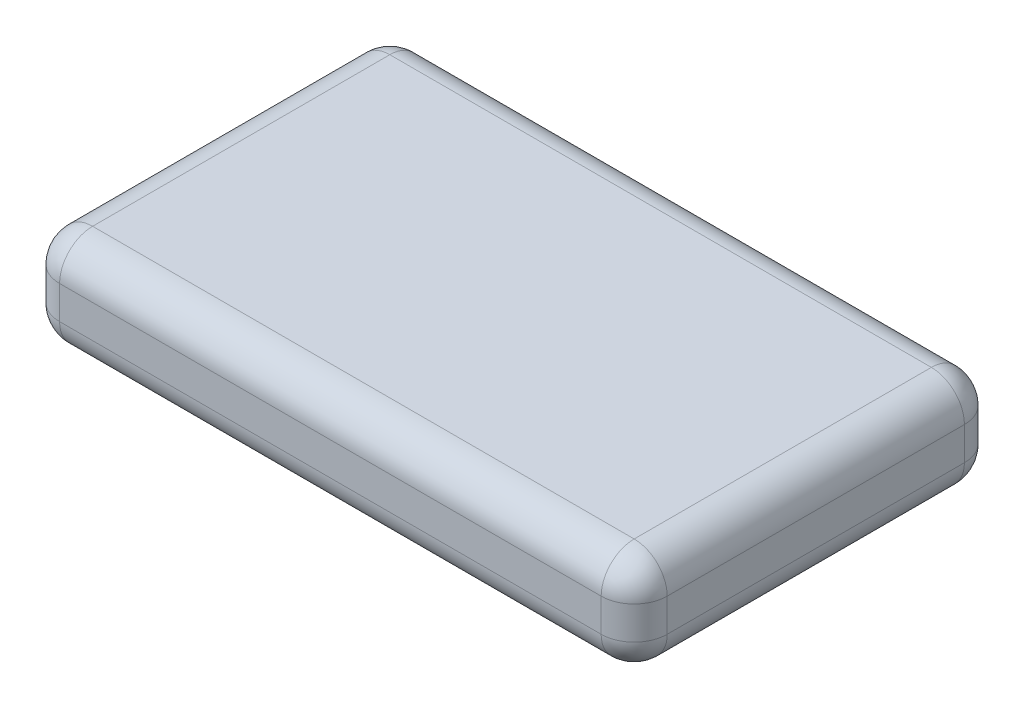
ISO-10303-21;
HEADER;
FILE_DESCRIPTION(('STEP AP214'),'2;1');
FILE_NAME('part.step','',(''),(''),'','','');
FILE_SCHEMA(('AUTOMOTIVE_DESIGN { 1 0 10303 214 1 1 1 1 }'));
ENDSEC;
DATA;
#1=APPLICATION_CONTEXT('core data for automotive mechanical design processes');
#2=APPLICATION_PROTOCOL_DEFINITION('international standard','automotive_design',2000,#1);
#3=PRODUCT_CONTEXT('',#1,'mechanical');
#4=PRODUCT('Part','Part','',(#3));
#5=PRODUCT_RELATED_PRODUCT_CATEGORY('part','',(#4));
#6=PRODUCT_DEFINITION_FORMATION('','',#4);
#7=PRODUCT_DEFINITION_CONTEXT('part definition',#1,'design');
#8=PRODUCT_DEFINITION('design','',#6,#7);
#9=PRODUCT_DEFINITION_SHAPE('','',#8);
#10=(LENGTH_UNIT() NAMED_UNIT(*) SI_UNIT(.MILLI.,.METRE.));
#11=(NAMED_UNIT(*) PLANE_ANGLE_UNIT() SI_UNIT($,.RADIAN.));
#12=(NAMED_UNIT(*) SI_UNIT($,.STERADIAN.) SOLID_ANGLE_UNIT());
#13=UNCERTAINTY_MEASURE_WITH_UNIT(LENGTH_MEASURE(1.E-05),#10,'distance_accuracy_value','');
#14=(GEOMETRIC_REPRESENTATION_CONTEXT(3) GLOBAL_UNCERTAINTY_ASSIGNED_CONTEXT((#13)) GLOBAL_UNIT_ASSIGNED_CONTEXT((#10,
#11,#12)) REPRESENTATION_CONTEXT('',''));
#15=CARTESIAN_POINT('',(0.,0.,0.));
#16=DIRECTION('',(0.,0.,1.));
#17=DIRECTION('',(1.,0.,0.));
#18=AXIS2_PLACEMENT_3D('',#15,#16,#17);
#19=CARTESIAN_POINT('',(0.,15.,0.));
#20=DIRECTION('',(1.,0.,0.));
#21=DIRECTION('',(0.,0.,-1.));
#22=AXIS2_PLACEMENT_3D('',#19,#20,#21);
#23=PLANE('',#22);
#24=DIRECTION('',(0.,-1.,0.));
#25=VECTOR('',#24,1.);
#26=CARTESIAN_POINT('',(0.,15.,-50.));
#27=LINE('',#26,#25);
#28=CARTESIAN_POINT('',(0.,10.,-50.));
#29=VERTEX_POINT('',#28);
#30=CARTESIAN_POINT('',(0.,5.,-50.));
#31=VERTEX_POINT('',#30);
#32=EDGE_CURVE('E195',#29,#31,#27,.T.);
#33=ORIENTED_EDGE('',*,*,#32,.T.);
#34=DIRECTION('',(0.,0.,1.));
#35=VECTOR('',#34,1.);
#36=CARTESIAN_POINT('',(0.,5.,0.));
#37=LINE('',#36,#35);
#38=CARTESIAN_POINT('',(0.,5.,-5.));
#39=VERTEX_POINT('',#38);
#40=EDGE_CURVE('E198',#31,#39,#37,.T.);
#41=ORIENTED_EDGE('',*,*,#40,.T.);
#42=DIRECTION('',(0.,-1.,0.));
#43=VECTOR('',#42,1.);
#44=CARTESIAN_POINT('',(0.,15.,-5.));
#45=LINE('',#44,#43);
#46=CARTESIAN_POINT('',(0.,10.,-5.));
#47=VERTEX_POINT('',#46);
#48=EDGE_CURVE('E193',#39,#47,#45,.F.);
#49=ORIENTED_EDGE('',*,*,#48,.T.);
#50=DIRECTION('',(0.,0.,1.));
#51=VECTOR('',#50,1.);
#52=CARTESIAN_POINT('',(0.,10.,0.));
#53=LINE('',#52,#51);
#54=EDGE_CURVE('E191',#47,#29,#53,.F.);
#55=ORIENTED_EDGE('',*,*,#54,.T.);
#56=EDGE_LOOP('',(#33,#41,#49,#55));
#57=FACE_BOUND('',#56,.T.);
#58=ADVANCED_FACE('F35',(#57),#23,.F.);
#59=CARTESIAN_POINT('',(0.,15.,0.));
#60=DIRECTION('',(0.,0.,-1.));
#61=DIRECTION('',(-1.,0.,0.));
#62=AXIS2_PLACEMENT_3D('',#59,#60,#61);
#63=PLANE('',#62);
#64=DIRECTION('',(1.,0.,0.));
#65=VECTOR('',#64,1.);
#66=CARTESIAN_POINT('',(92.,5.,0.));
#67=LINE('',#66,#65);
#68=CARTESIAN_POINT('',(5.,5.,0.));
#69=VERTEX_POINT('',#68);
#70=CARTESIAN_POINT('',(87.,5.,0.));
#71=VERTEX_POINT('',#70);
#72=EDGE_CURVE('E170',#69,#71,#67,.T.);
#73=ORIENTED_EDGE('',*,*,#72,.T.);
#74=DIRECTION('',(0.,-1.,0.));
#75=VECTOR('',#74,1.);
#76=CARTESIAN_POINT('',(87.,15.,0.));
#77=LINE('',#76,#75);
#78=CARTESIAN_POINT('',(87.,10.,0.));
#79=VERTEX_POINT('',#78);
#80=EDGE_CURVE('E172',#71,#79,#77,.F.);
#81=ORIENTED_EDGE('',*,*,#80,.T.);
#82=DIRECTION('',(1.,0.,0.));
#83=VECTOR('',#82,1.);
#84=CARTESIAN_POINT('',(0.,10.,0.));
#85=LINE('',#84,#83);
#86=CARTESIAN_POINT('',(5.,10.,0.));
#87=VERTEX_POINT('',#86);
#88=EDGE_CURVE('E166',#79,#87,#85,.F.);
#89=ORIENTED_EDGE('',*,*,#88,.T.);
#90=DIRECTION('',(0.,-1.,0.));
#91=VECTOR('',#90,1.);
#92=CARTESIAN_POINT('',(5.,15.,0.));
#93=LINE('',#92,#91);
#94=EDGE_CURVE('E168',#87,#69,#93,.T.);
#95=ORIENTED_EDGE('',*,*,#94,.T.);
#96=EDGE_LOOP('',(#73,#81,#89,#95));
#97=FACE_BOUND('',#96,.T.);
#98=ADVANCED_FACE('F307',(#97),#63,.F.);
#99=CARTESIAN_POINT('',(92.,15.,0.));
#100=DIRECTION('',(-1.,0.,0.));
#101=DIRECTION('',(0.,0.,1.));
#102=AXIS2_PLACEMENT_3D('',#99,#100,#101);
#103=PLANE('',#102);
#104=DIRECTION('',(0.,-1.,0.));
#105=VECTOR('',#104,1.);
#106=CARTESIAN_POINT('',(92.,15.,-5.));
#107=LINE('',#106,#105);
#108=CARTESIAN_POINT('',(92.,10.,-5.));
#109=VERTEX_POINT('',#108);
#110=CARTESIAN_POINT('',(92.,5.,-5.));
#111=VERTEX_POINT('',#110);
#112=EDGE_CURVE('E134',#109,#111,#107,.T.);
#113=ORIENTED_EDGE('',*,*,#112,.T.);
#114=DIRECTION('',(0.,0.,-1.));
#115=VECTOR('',#114,1.);
#116=CARTESIAN_POINT('',(92.,5.,-55.));
#117=LINE('',#116,#115);
#118=CARTESIAN_POINT('',(92.,5.,-50.));
#119=VERTEX_POINT('',#118);
#120=EDGE_CURVE('E130',#111,#119,#117,.T.);
#121=ORIENTED_EDGE('',*,*,#120,.T.);
#122=DIRECTION('',(0.,-1.,0.));
#123=VECTOR('',#122,1.);
#124=CARTESIAN_POINT('',(92.,15.,-50.));
#125=LINE('',#124,#123);
#126=CARTESIAN_POINT('',(92.,10.,-50.));
#127=VERTEX_POINT('',#126);
#128=EDGE_CURVE('E122',#119,#127,#125,.F.);
#129=ORIENTED_EDGE('',*,*,#128,.T.);
#130=DIRECTION('',(0.,0.,-1.));
#131=VECTOR('',#130,1.);
#132=CARTESIAN_POINT('',(92.,10.,0.));
#133=LINE('',#132,#131);
#134=EDGE_CURVE('E127',#127,#109,#133,.F.);
#135=ORIENTED_EDGE('',*,*,#134,.T.);
#136=EDGE_LOOP('',(#113,#121,#129,#135));
#137=FACE_BOUND('',#136,.T.);
#138=ADVANCED_FACE('F125',(#137),#103,.F.);
#139=CARTESIAN_POINT('',(0.,15.,-55.));
#140=DIRECTION('',(0.,0.,1.));
#141=DIRECTION('',(1.,0.,0.));
#142=AXIS2_PLACEMENT_3D('',#139,#140,#141);
#143=PLANE('',#142);
#144=DIRECTION('',(-1.,0.,0.));
#145=VECTOR('',#144,1.);
#146=CARTESIAN_POINT('',(0.,10.,-55.));
#147=LINE('',#146,#145);
#148=CARTESIAN_POINT('',(5.,10.,-55.));
#149=VERTEX_POINT('',#148);
#150=CARTESIAN_POINT('',(87.,10.,-55.));
#151=VERTEX_POINT('',#150);
#152=EDGE_CURVE('E175',#149,#151,#147,.F.);
#153=ORIENTED_EDGE('',*,*,#152,.T.);
#154=DIRECTION('',(0.,-1.,0.));
#155=VECTOR('',#154,1.);
#156=CARTESIAN_POINT('',(87.,15.,-55.));
#157=LINE('',#156,#155);
#158=CARTESIAN_POINT('',(87.,5.,-55.));
#159=VERTEX_POINT('',#158);
#160=EDGE_CURVE('E142',#151,#159,#157,.T.);
#161=ORIENTED_EDGE('',*,*,#160,.T.);
#162=DIRECTION('',(-1.,0.,0.));
#163=VECTOR('',#162,1.);
#164=CARTESIAN_POINT('',(0.,5.,-55.));
#165=LINE('',#164,#163);
#166=CARTESIAN_POINT('',(5.,5.,-55.));
#167=VERTEX_POINT('',#166);
#168=EDGE_CURVE('E179',#159,#167,#165,.T.);
#169=ORIENTED_EDGE('',*,*,#168,.T.);
#170=DIRECTION('',(0.,-1.,0.));
#171=VECTOR('',#170,1.);
#172=CARTESIAN_POINT('',(5.,15.,-55.));
#173=LINE('',#172,#171);
#174=EDGE_CURVE('E177',#167,#149,#173,.F.);
#175=ORIENTED_EDGE('',*,*,#174,.T.);
#176=EDGE_LOOP('',(#153,#161,#169,#175));
#177=FACE_BOUND('',#176,.T.);
#178=ADVANCED_FACE('F298',(#177),#143,.F.);
#179=CARTESIAN_POINT('',(0.,15.,0.));
#180=DIRECTION('',(0.,-1.,0.));
#181=DIRECTION('',(0.,0.,-1.));
#182=AXIS2_PLACEMENT_3D('',#179,#180,#181);
#183=PLANE('',#182);
#184=DIRECTION('',(0.,0.,-1.));
#185=VECTOR('',#184,1.);
#186=CARTESIAN_POINT('',(87.,15.,0.));
#187=LINE('',#186,#185);
#188=CARTESIAN_POINT('',(87.,15.,-5.));
#189=VERTEX_POINT('',#188);
#190=CARTESIAN_POINT('',(87.,15.,-50.));
#191=VERTEX_POINT('',#190);
#192=EDGE_CURVE('E44',#189,#191,#187,.T.);
#193=ORIENTED_EDGE('',*,*,#192,.T.);
#194=DIRECTION('',(-1.,0.,0.));
#195=VECTOR('',#194,1.);
#196=CARTESIAN_POINT('',(0.,15.,-50.));
#197=LINE('',#196,#195);
#198=CARTESIAN_POINT('',(5.,15.,-50.));
#199=VERTEX_POINT('',#198);
#200=EDGE_CURVE('E11',#191,#199,#197,.T.);
#201=ORIENTED_EDGE('',*,*,#200,.T.);
#202=DIRECTION('',(0.,0.,1.));
#203=VECTOR('',#202,1.);
#204=CARTESIAN_POINT('',(5.,15.,0.));
#205=LINE('',#204,#203);
#206=CARTESIAN_POINT('',(5.,15.,-5.));
#207=VERTEX_POINT('',#206);
#208=EDGE_CURVE('E200',#199,#207,#205,.T.);
#209=ORIENTED_EDGE('',*,*,#208,.T.);
#210=DIRECTION('',(1.,0.,0.));
#211=VECTOR('',#210,1.);
#212=CARTESIAN_POINT('',(0.,15.,-5.));
#213=LINE('',#212,#211);
#214=EDGE_CURVE('E55',#207,#189,#213,.T.);
#215=ORIENTED_EDGE('',*,*,#214,.T.);
#216=EDGE_LOOP('',(#193,#201,#209,#215));
#217=FACE_BOUND('',#216,.T.);
#218=ADVANCED_FACE('F300',(#217),#183,.F.);
#219=CARTESIAN_POINT('',(0.,0.,0.));
#220=DIRECTION('',(0.,-1.,0.));
#221=DIRECTION('',(0.,0.,-1.));
#222=AXIS2_PLACEMENT_3D('',#219,#220,#221);
#223=PLANE('',#222);
#224=DIRECTION('',(0.,0.,-1.));
#225=VECTOR('',#224,1.);
#226=CARTESIAN_POINT('',(87.,0.,0.));
#227=LINE('',#226,#225);
#228=CARTESIAN_POINT('',(87.,0.,-50.));
#229=VERTEX_POINT('',#228);
#230=CARTESIAN_POINT('',(87.,0.,-5.));
#231=VERTEX_POINT('',#230);
#232=EDGE_CURVE('E186',#229,#231,#227,.F.);
#233=ORIENTED_EDGE('',*,*,#232,.T.);
#234=DIRECTION('',(1.,0.,0.));
#235=VECTOR('',#234,1.);
#236=CARTESIAN_POINT('',(0.,0.,-5.));
#237=LINE('',#236,#235);
#238=CARTESIAN_POINT('',(5.,0.,-5.));
#239=VERTEX_POINT('',#238);
#240=EDGE_CURVE('E188',#231,#239,#237,.F.);
#241=ORIENTED_EDGE('',*,*,#240,.T.);
#242=DIRECTION('',(0.,0.,1.));
#243=VECTOR('',#242,1.);
#244=CARTESIAN_POINT('',(5.,0.,-55.));
#245=LINE('',#244,#243);
#246=CARTESIAN_POINT('',(5.,0.,-50.));
#247=VERTEX_POINT('',#246);
#248=EDGE_CURVE('E182',#239,#247,#245,.F.);
#249=ORIENTED_EDGE('',*,*,#248,.T.);
#250=DIRECTION('',(-1.,0.,0.));
#251=VECTOR('',#250,1.);
#252=CARTESIAN_POINT('',(92.,0.,-50.));
#253=LINE('',#252,#251);
#254=EDGE_CURVE('E184',#247,#229,#253,.F.);
#255=ORIENTED_EDGE('',*,*,#254,.T.);
#256=EDGE_LOOP('',(#233,#241,#249,#255));
#257=FACE_BOUND('',#256,.T.);
#258=ADVANCED_FACE('F267',(#257),#223,.T.);
#259=CARTESIAN_POINT('',(5.,15.,-50.));
#260=DIRECTION('',(0.,-1.,0.));
#261=DIRECTION('',(0.,0.,-1.));
#262=AXIS2_PLACEMENT_3D('',#259,#260,#261);
#263=CYLINDRICAL_SURFACE('',#262,5.);
#264=CARTESIAN_POINT('',(5.,10.,-50.));
#265=DIRECTION('',(0.,1.,0.));
#266=DIRECTION('',(0.,0.,1.));
#267=AXIS2_PLACEMENT_3D('',#264,#265,#266);
#268=CIRCLE('',#267,5.);
#269=EDGE_CURVE('E39',#149,#29,#268,.T.);
#270=ORIENTED_EDGE('',*,*,#269,.F.);
#271=ORIENTED_EDGE('',*,*,#174,.F.);
#272=CARTESIAN_POINT('',(5.,5.,-50.));
#273=DIRECTION('',(0.,-1.,0.));
#274=DIRECTION('',(0.,0.,-1.));
#275=AXIS2_PLACEMENT_3D('',#272,#273,#274);
#276=CIRCLE('',#275,5.);
#277=EDGE_CURVE('E162',#31,#167,#276,.T.);
#278=ORIENTED_EDGE('',*,*,#277,.F.);
#279=ORIENTED_EDGE('',*,*,#32,.F.);
#280=EDGE_LOOP('',(#270,#271,#278,#279));
#281=FACE_BOUND('',#280,.T.);
#282=ADVANCED_FACE('F37',(#281),#263,.T.);
#283=CARTESIAN_POINT('',(5.,10.,-50.));
#284=DIRECTION('',(0.,0.,1.));
#285=DIRECTION('',(1.,0.,0.));
#286=AXIS2_PLACEMENT_3D('',#283,#284,#285);
#287=SPHERICAL_SURFACE('',#286,5.);
#288=CARTESIAN_POINT('',(5.,10.,-50.));
#289=DIRECTION('',(-1.,0.,0.));
#290=DIRECTION('',(0.,0.,1.));
#291=AXIS2_PLACEMENT_3D('',#288,#289,#290);
#292=CIRCLE('',#291,5.);
#293=EDGE_CURVE('E246',#149,#199,#292,.F.);
#294=ORIENTED_EDGE('',*,*,#293,.F.);
#295=ORIENTED_EDGE('',*,*,#269,.T.);
#296=CARTESIAN_POINT('',(5.,10.,-50.));
#297=DIRECTION('',(0.,0.,-1.));
#298=DIRECTION('',(-1.,0.,0.));
#299=AXIS2_PLACEMENT_3D('',#296,#297,#298);
#300=CIRCLE('',#299,5.);
#301=EDGE_CURVE('E249',#199,#29,#300,.F.);
#302=ORIENTED_EDGE('',*,*,#301,.F.);
#303=EDGE_LOOP('',(#294,#295,#302));
#304=FACE_BOUND('',#303,.T.);
#305=ADVANCED_FACE('F293',(#304),#287,.T.);
#306=CARTESIAN_POINT('',(5.,5.,-50.));
#307=DIRECTION('',(0.,0.,1.));
#308=DIRECTION('',(1.,0.,0.));
#309=AXIS2_PLACEMENT_3D('',#306,#307,#308);
#310=SPHERICAL_SURFACE('',#309,5.);
#311=CARTESIAN_POINT('',(5.,5.,-50.));
#312=DIRECTION('',(0.,0.,-1.));
#313=DIRECTION('',(-1.,0.,0.));
#314=AXIS2_PLACEMENT_3D('',#311,#312,#313);
#315=CIRCLE('',#314,5.);
#316=EDGE_CURVE('E240',#31,#247,#315,.F.);
#317=ORIENTED_EDGE('',*,*,#316,.F.);
#318=ORIENTED_EDGE('',*,*,#277,.T.);
#319=CARTESIAN_POINT('',(5.,5.,-50.));
#320=DIRECTION('',(-1.,0.,0.));
#321=DIRECTION('',(0.,0.,1.));
#322=AXIS2_PLACEMENT_3D('',#319,#320,#321);
#323=CIRCLE('',#322,5.);
#324=EDGE_CURVE('E243',#247,#167,#323,.F.);
#325=ORIENTED_EDGE('',*,*,#324,.F.);
#326=EDGE_LOOP('',(#317,#318,#325));
#327=FACE_BOUND('',#326,.T.);
#328=ADVANCED_FACE('F256',(#327),#310,.T.);
#329=CARTESIAN_POINT('',(5.,10.,0.));
#330=DIRECTION('',(0.,0.,1.));
#331=DIRECTION('',(1.,0.,0.));
#332=AXIS2_PLACEMENT_3D('',#329,#330,#331);
#333=CYLINDRICAL_SURFACE('',#332,5.);
#334=ORIENTED_EDGE('',*,*,#301,.T.);
#335=ORIENTED_EDGE('',*,*,#54,.F.);
#336=CARTESIAN_POINT('',(5.,10.,-5.));
#337=DIRECTION('',(0.,0.,1.));
#338=DIRECTION('',(1.,0.,0.));
#339=AXIS2_PLACEMENT_3D('',#336,#337,#338);
#340=CIRCLE('',#339,5.);
#341=EDGE_CURVE('E234',#207,#47,#340,.T.);
#342=ORIENTED_EDGE('',*,*,#341,.F.);
#343=ORIENTED_EDGE('',*,*,#208,.F.);
#344=EDGE_LOOP('',(#334,#335,#342,#343));
#345=FACE_BOUND('',#344,.T.);
#346=ADVANCED_FACE('F288',(#345),#333,.T.);
#347=CARTESIAN_POINT('',(0.,10.,-50.));
#348=DIRECTION('',(-1.,0.,0.));
#349=DIRECTION('',(0.,0.,1.));
#350=AXIS2_PLACEMENT_3D('',#347,#348,#349);
#351=CYLINDRICAL_SURFACE('',#350,5.);
#352=ORIENTED_EDGE('',*,*,#293,.T.);
#353=ORIENTED_EDGE('',*,*,#200,.F.);
#354=CARTESIAN_POINT('',(87.,10.,-50.));
#355=DIRECTION('',(1.,0.,0.));
#356=DIRECTION('',(0.,0.,-1.));
#357=AXIS2_PLACEMENT_3D('',#354,#355,#356);
#358=CIRCLE('',#357,5.);
#359=EDGE_CURVE('E146',#151,#191,#358,.T.);
#360=ORIENTED_EDGE('',*,*,#359,.F.);
#361=ORIENTED_EDGE('',*,*,#152,.F.);
#362=EDGE_LOOP('',(#352,#353,#360,#361));
#363=FACE_BOUND('',#362,.T.);
#364=ADVANCED_FACE('F296',(#363),#351,.T.);
#365=CARTESIAN_POINT('',(87.,15.,-50.));
#366=DIRECTION('',(0.,-1.,0.));
#367=DIRECTION('',(0.,0.,-1.));
#368=AXIS2_PLACEMENT_3D('',#365,#366,#367);
#369=CYLINDRICAL_SURFACE('',#368,5.);
#370=CARTESIAN_POINT('',(87.,5.,-50.));
#371=DIRECTION('',(0.,-1.,0.));
#372=DIRECTION('',(0.,0.,-1.));
#373=AXIS2_PLACEMENT_3D('',#370,#371,#372);
#374=CIRCLE('',#373,5.);
#375=EDGE_CURVE('E147',#159,#119,#374,.T.);
#376=ORIENTED_EDGE('',*,*,#375,.F.);
#377=ORIENTED_EDGE('',*,*,#160,.F.);
#378=CARTESIAN_POINT('',(87.,10.,-50.));
#379=DIRECTION('',(0.,1.,0.));
#380=DIRECTION('',(0.,0.,1.));
#381=AXIS2_PLACEMENT_3D('',#378,#379,#380);
#382=CIRCLE('',#381,5.);
#383=EDGE_CURVE('E138',#127,#151,#382,.T.);
#384=ORIENTED_EDGE('',*,*,#383,.F.);
#385=ORIENTED_EDGE('',*,*,#128,.F.);
#386=EDGE_LOOP('',(#376,#377,#384,#385));
#387=FACE_BOUND('',#386,.T.);
#388=ADVANCED_FACE('F140',(#387),#369,.T.);
#389=CARTESIAN_POINT('',(0.,5.,-50.));
#390=DIRECTION('',(1.,0.,0.));
#391=DIRECTION('',(0.,0.,-1.));
#392=AXIS2_PLACEMENT_3D('',#389,#390,#391);
#393=CYLINDRICAL_SURFACE('',#392,5.);
#394=ORIENTED_EDGE('',*,*,#324,.T.);
#395=ORIENTED_EDGE('',*,*,#168,.F.);
#396=CARTESIAN_POINT('',(87.,5.,-50.));
#397=DIRECTION('',(1.,0.,0.));
#398=DIRECTION('',(0.,0.,-1.));
#399=AXIS2_PLACEMENT_3D('',#396,#397,#398);
#400=CIRCLE('',#399,5.);
#401=EDGE_CURVE('E230',#229,#159,#400,.T.);
#402=ORIENTED_EDGE('',*,*,#401,.F.);
#403=ORIENTED_EDGE('',*,*,#254,.F.);
#404=EDGE_LOOP('',(#394,#395,#402,#403));
#405=FACE_BOUND('',#404,.T.);
#406=ADVANCED_FACE('F263',(#405),#393,.T.);
#407=CARTESIAN_POINT('',(5.,5.,0.));
#408=DIRECTION('',(0.,0.,-1.));
#409=DIRECTION('',(-1.,0.,0.));
#410=AXIS2_PLACEMENT_3D('',#407,#408,#409);
#411=CYLINDRICAL_SURFACE('',#410,5.);
#412=ORIENTED_EDGE('',*,*,#316,.T.);
#413=ORIENTED_EDGE('',*,*,#248,.F.);
#414=CARTESIAN_POINT('',(5.,5.,-5.));
#415=DIRECTION('',(0.,0.,1.));
#416=DIRECTION('',(1.,0.,0.));
#417=AXIS2_PLACEMENT_3D('',#414,#415,#416);
#418=CIRCLE('',#417,5.);
#419=EDGE_CURVE('E227',#39,#239,#418,.T.);
#420=ORIENTED_EDGE('',*,*,#419,.F.);
#421=ORIENTED_EDGE('',*,*,#40,.F.);
#422=EDGE_LOOP('',(#412,#413,#420,#421));
#423=FACE_BOUND('',#422,.T.);
#424=ADVANCED_FACE('F273',(#423),#411,.T.);
#425=CARTESIAN_POINT('',(5.,15.,-5.));
#426=DIRECTION('',(0.,-1.,0.));
#427=DIRECTION('',(0.,0.,-1.));
#428=AXIS2_PLACEMENT_3D('',#425,#426,#427);
#429=CYLINDRICAL_SURFACE('',#428,5.);
#430=CARTESIAN_POINT('',(5.,10.,-5.));
#431=DIRECTION('',(0.,1.,0.));
#432=DIRECTION('',(0.,0.,1.));
#433=AXIS2_PLACEMENT_3D('',#430,#431,#432);
#434=CIRCLE('',#433,5.);
#435=EDGE_CURVE('E237',#47,#87,#434,.T.);
#436=ORIENTED_EDGE('',*,*,#435,.F.);
#437=ORIENTED_EDGE('',*,*,#48,.F.);
#438=CARTESIAN_POINT('',(5.,5.,-5.));
#439=DIRECTION('',(0.,-1.,0.));
#440=DIRECTION('',(0.,0.,-1.));
#441=AXIS2_PLACEMENT_3D('',#438,#439,#440);
#442=CIRCLE('',#441,5.);
#443=EDGE_CURVE('E224',#69,#39,#442,.T.);
#444=ORIENTED_EDGE('',*,*,#443,.F.);
#445=ORIENTED_EDGE('',*,*,#94,.F.);
#446=EDGE_LOOP('',(#436,#437,#444,#445));
#447=FACE_BOUND('',#446,.T.);
#448=ADVANCED_FACE('F280',(#447),#429,.T.);
#449=CARTESIAN_POINT('',(5.,10.,-5.));
#450=DIRECTION('',(0.,0.,1.));
#451=DIRECTION('',(1.,0.,0.));
#452=AXIS2_PLACEMENT_3D('',#449,#450,#451);
#453=SPHERICAL_SURFACE('',#452,5.);
#454=ORIENTED_EDGE('',*,*,#341,.T.);
#455=ORIENTED_EDGE('',*,*,#435,.T.);
#456=CARTESIAN_POINT('',(5.,10.,-5.));
#457=DIRECTION('',(-1.,0.,0.));
#458=DIRECTION('',(0.,0.,1.));
#459=AXIS2_PLACEMENT_3D('',#456,#457,#458);
#460=CIRCLE('',#459,5.);
#461=EDGE_CURVE('E153',#207,#87,#460,.F.);
#462=ORIENTED_EDGE('',*,*,#461,.F.);
#463=EDGE_LOOP('',(#454,#455,#462));
#464=FACE_BOUND('',#463,.T.);
#465=ADVANCED_FACE('F286',(#464),#453,.T.);
#466=CARTESIAN_POINT('',(87.,10.,-50.));
#467=DIRECTION('',(0.,0.,1.));
#468=DIRECTION('',(1.,0.,0.));
#469=AXIS2_PLACEMENT_3D('',#466,#467,#468);
#470=SPHERICAL_SURFACE('',#469,5.);
#471=ORIENTED_EDGE('',*,*,#383,.T.);
#472=ORIENTED_EDGE('',*,*,#359,.T.);
#473=CARTESIAN_POINT('',(87.,10.,-50.));
#474=DIRECTION('',(0.,0.,-1.));
#475=DIRECTION('',(-1.,0.,0.));
#476=AXIS2_PLACEMENT_3D('',#473,#474,#475);
#477=CIRCLE('',#476,5.);
#478=EDGE_CURVE('E150',#127,#191,#477,.F.);
#479=ORIENTED_EDGE('',*,*,#478,.F.);
#480=EDGE_LOOP('',(#471,#472,#479));
#481=FACE_BOUND('',#480,.T.);
#482=ADVANCED_FACE('F151',(#481),#470,.T.);
#483=CARTESIAN_POINT('',(87.,5.,-50.));
#484=DIRECTION('',(0.,0.,1.));
#485=DIRECTION('',(1.,0.,0.));
#486=AXIS2_PLACEMENT_3D('',#483,#484,#485);
#487=SPHERICAL_SURFACE('',#486,5.);
#488=ORIENTED_EDGE('',*,*,#401,.T.);
#489=ORIENTED_EDGE('',*,*,#375,.T.);
#490=CARTESIAN_POINT('',(87.,5.,-50.));
#491=DIRECTION('',(0.,0.,-1.));
#492=DIRECTION('',(-1.,0.,0.));
#493=AXIS2_PLACEMENT_3D('',#490,#491,#492);
#494=CIRCLE('',#493,5.);
#495=EDGE_CURVE('E154',#229,#119,#494,.F.);
#496=ORIENTED_EDGE('',*,*,#495,.F.);
#497=EDGE_LOOP('',(#488,#489,#496));
#498=FACE_BOUND('',#497,.T.);
#499=ADVANCED_FACE('F347',(#498),#487,.T.);
#500=CARTESIAN_POINT('',(5.,5.,-5.));
#501=DIRECTION('',(0.,0.,1.));
#502=DIRECTION('',(1.,0.,0.));
#503=AXIS2_PLACEMENT_3D('',#500,#501,#502);
#504=SPHERICAL_SURFACE('',#503,5.);
#505=ORIENTED_EDGE('',*,*,#443,.T.);
#506=ORIENTED_EDGE('',*,*,#419,.T.);
#507=CARTESIAN_POINT('',(5.,5.,-5.));
#508=DIRECTION('',(-1.,0.,0.));
#509=DIRECTION('',(0.,0.,1.));
#510=AXIS2_PLACEMENT_3D('',#507,#508,#509);
#511=CIRCLE('',#510,5.);
#512=EDGE_CURVE('E218',#69,#239,#511,.F.);
#513=ORIENTED_EDGE('',*,*,#512,.F.);
#514=EDGE_LOOP('',(#505,#506,#513));
#515=FACE_BOUND('',#514,.T.);
#516=ADVANCED_FACE('F343',(#515),#504,.T.);
#517=CARTESIAN_POINT('',(0.,10.,-5.));
#518=DIRECTION('',(1.,0.,0.));
#519=DIRECTION('',(0.,0.,-1.));
#520=AXIS2_PLACEMENT_3D('',#517,#518,#519);
#521=CYLINDRICAL_SURFACE('',#520,5.);
#522=ORIENTED_EDGE('',*,*,#461,.T.);
#523=ORIENTED_EDGE('',*,*,#88,.F.);
#524=CARTESIAN_POINT('',(87.,10.,-5.));
#525=DIRECTION('',(1.,0.,0.));
#526=DIRECTION('',(0.,0.,-1.));
#527=AXIS2_PLACEMENT_3D('',#524,#525,#526);
#528=CIRCLE('',#527,5.);
#529=EDGE_CURVE('E215',#189,#79,#528,.T.);
#530=ORIENTED_EDGE('',*,*,#529,.F.);
#531=ORIENTED_EDGE('',*,*,#214,.F.);
#532=EDGE_LOOP('',(#522,#523,#530,#531));
#533=FACE_BOUND('',#532,.T.);
#534=ADVANCED_FACE('F340',(#533),#521,.T.);
#535=CARTESIAN_POINT('',(87.,10.,0.));
#536=DIRECTION('',(0.,0.,-1.));
#537=DIRECTION('',(-1.,0.,0.));
#538=AXIS2_PLACEMENT_3D('',#535,#536,#537);
#539=CYLINDRICAL_SURFACE('',#538,5.);
#540=ORIENTED_EDGE('',*,*,#478,.T.);
#541=ORIENTED_EDGE('',*,*,#192,.F.);
#542=CARTESIAN_POINT('',(87.,10.,-5.));
#543=DIRECTION('',(0.,0.,1.));
#544=DIRECTION('',(1.,0.,0.));
#545=AXIS2_PLACEMENT_3D('',#542,#543,#544);
#546=CIRCLE('',#545,5.);
#547=EDGE_CURVE('E158',#109,#189,#546,.T.);
#548=ORIENTED_EDGE('',*,*,#547,.F.);
#549=ORIENTED_EDGE('',*,*,#134,.F.);
#550=EDGE_LOOP('',(#540,#541,#548,#549));
#551=FACE_BOUND('',#550,.T.);
#552=ADVANCED_FACE('F156',(#551),#539,.T.);
#553=CARTESIAN_POINT('',(87.,5.,0.));
#554=DIRECTION('',(0.,0.,1.));
#555=DIRECTION('',(1.,0.,0.));
#556=AXIS2_PLACEMENT_3D('',#553,#554,#555);
#557=CYLINDRICAL_SURFACE('',#556,5.);
#558=ORIENTED_EDGE('',*,*,#495,.T.);
#559=ORIENTED_EDGE('',*,*,#120,.F.);
#560=CARTESIAN_POINT('',(87.,5.,-5.));
#561=DIRECTION('',(0.,0.,1.));
#562=DIRECTION('',(1.,0.,0.));
#563=AXIS2_PLACEMENT_3D('',#560,#561,#562);
#564=CIRCLE('',#563,5.);
#565=EDGE_CURVE('E211',#231,#111,#564,.T.);
#566=ORIENTED_EDGE('',*,*,#565,.F.);
#567=ORIENTED_EDGE('',*,*,#232,.F.);
#568=EDGE_LOOP('',(#558,#559,#566,#567));
#569=FACE_BOUND('',#568,.T.);
#570=ADVANCED_FACE('F333',(#569),#557,.T.);
#571=CARTESIAN_POINT('',(0.,5.,-5.));
#572=DIRECTION('',(-1.,0.,0.));
#573=DIRECTION('',(0.,0.,1.));
#574=AXIS2_PLACEMENT_3D('',#571,#572,#573);
#575=CYLINDRICAL_SURFACE('',#574,5.);
#576=ORIENTED_EDGE('',*,*,#512,.T.);
#577=ORIENTED_EDGE('',*,*,#240,.F.);
#578=CARTESIAN_POINT('',(87.,5.,-5.));
#579=DIRECTION('',(1.,0.,0.));
#580=DIRECTION('',(0.,0.,-1.));
#581=AXIS2_PLACEMENT_3D('',#578,#579,#580);
#582=CIRCLE('',#581,5.);
#583=EDGE_CURVE('E208',#71,#231,#582,.T.);
#584=ORIENTED_EDGE('',*,*,#583,.F.);
#585=ORIENTED_EDGE('',*,*,#72,.F.);
#586=EDGE_LOOP('',(#576,#577,#584,#585));
#587=FACE_BOUND('',#586,.T.);
#588=ADVANCED_FACE('F329',(#587),#575,.T.);
#589=CARTESIAN_POINT('',(87.,10.,-5.));
#590=DIRECTION('',(0.,0.,1.));
#591=DIRECTION('',(1.,0.,0.));
#592=AXIS2_PLACEMENT_3D('',#589,#590,#591);
#593=SPHERICAL_SURFACE('',#592,5.);
#594=ORIENTED_EDGE('',*,*,#547,.T.);
#595=ORIENTED_EDGE('',*,*,#529,.T.);
#596=CARTESIAN_POINT('',(87.,10.,-5.));
#597=DIRECTION('',(0.,1.,0.));
#598=DIRECTION('',(0.,0.,1.));
#599=AXIS2_PLACEMENT_3D('',#596,#597,#598);
#600=CIRCLE('',#599,5.);
#601=EDGE_CURVE('E206',#109,#79,#600,.F.);
#602=ORIENTED_EDGE('',*,*,#601,.F.);
#603=EDGE_LOOP('',(#594,#595,#602));
#604=FACE_BOUND('',#603,.T.);
#605=ADVANCED_FACE('F325',(#604),#593,.T.);
#606=CARTESIAN_POINT('',(87.,5.,-5.));
#607=DIRECTION('',(0.,0.,1.));
#608=DIRECTION('',(1.,0.,0.));
#609=AXIS2_PLACEMENT_3D('',#606,#607,#608);
#610=SPHERICAL_SURFACE('',#609,5.);
#611=ORIENTED_EDGE('',*,*,#583,.T.);
#612=ORIENTED_EDGE('',*,*,#565,.T.);
#613=CARTESIAN_POINT('',(87.,5.,-5.));
#614=DIRECTION('',(0.,-1.,0.));
#615=DIRECTION('',(0.,0.,-1.));
#616=AXIS2_PLACEMENT_3D('',#613,#614,#615);
#617=CIRCLE('',#616,5.);
#618=EDGE_CURVE('E204',#71,#111,#617,.F.);
#619=ORIENTED_EDGE('',*,*,#618,.F.);
#620=EDGE_LOOP('',(#611,#612,#619));
#621=FACE_BOUND('',#620,.T.);
#622=ADVANCED_FACE('F321',(#621),#610,.T.);
#623=CARTESIAN_POINT('',(87.,15.,-5.));
#624=DIRECTION('',(0.,-1.,0.));
#625=DIRECTION('',(0.,0.,-1.));
#626=AXIS2_PLACEMENT_3D('',#623,#624,#625);
#627=CYLINDRICAL_SURFACE('',#626,5.);
#628=ORIENTED_EDGE('',*,*,#601,.T.);
#629=ORIENTED_EDGE('',*,*,#80,.F.);
#630=ORIENTED_EDGE('',*,*,#618,.T.);
#631=ORIENTED_EDGE('',*,*,#112,.F.);
#632=EDGE_LOOP('',(#628,#629,#630,#631));
#633=FACE_BOUND('',#632,.T.);
#634=ADVANCED_FACE('F318',(#633),#627,.T.);
#635=CLOSED_SHELL('',(#58,#98,#138,#178,#218,#258,#282,#305,#328,#346,#364,#388,#406,#424,#448,
#465,#482,#499,#516,#534,#552,#570,#588,#605,#622,#634));
#636=MANIFOLD_SOLID_BREP('B2',#635);
#637=ADVANCED_BREP_SHAPE_REPRESENTATION('',(#18,#636),#14);
#638=SHAPE_DEFINITION_REPRESENTATION(#9,#637);
ENDSEC;
END-ISO-10303-21;
